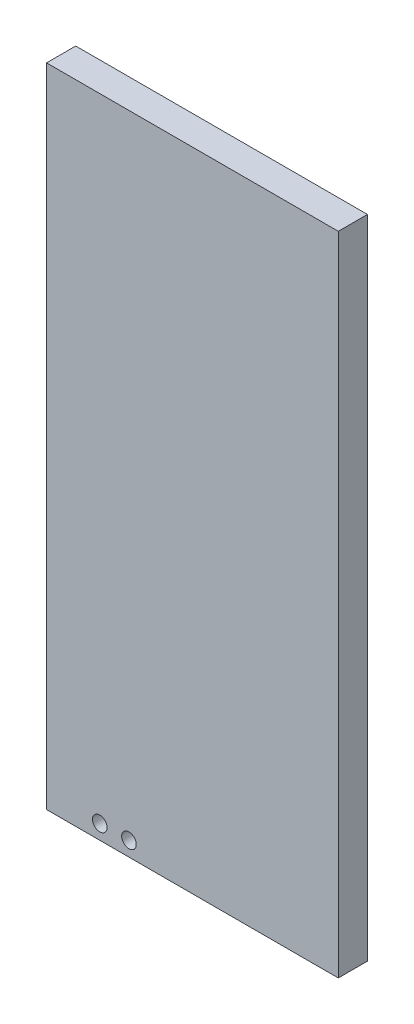
ISO-10303-21;
HEADER;
FILE_DESCRIPTION(('STEP AP214'),'2;1');
FILE_NAME('part.step','',(''),(''),'','','');
FILE_SCHEMA(('AUTOMOTIVE_DESIGN { 1 0 10303 214 1 1 1 1 }'));
ENDSEC;
DATA;
#1=APPLICATION_CONTEXT('core data for automotive mechanical design processes');
#2=APPLICATION_PROTOCOL_DEFINITION('international standard','automotive_design',2000,#1);
#3=PRODUCT_CONTEXT('',#1,'mechanical');
#4=PRODUCT('Part','Part','',(#3));
#5=PRODUCT_RELATED_PRODUCT_CATEGORY('part','',(#4));
#6=PRODUCT_DEFINITION_FORMATION('','',#4);
#7=PRODUCT_DEFINITION_CONTEXT('part definition',#1,'design');
#8=PRODUCT_DEFINITION('design','',#6,#7);
#9=PRODUCT_DEFINITION_SHAPE('','',#8);
#10=(LENGTH_UNIT() NAMED_UNIT(*) SI_UNIT(.MILLI.,.METRE.));
#11=(NAMED_UNIT(*) PLANE_ANGLE_UNIT() SI_UNIT($,.RADIAN.));
#12=(NAMED_UNIT(*) SI_UNIT($,.STERADIAN.) SOLID_ANGLE_UNIT());
#13=UNCERTAINTY_MEASURE_WITH_UNIT(LENGTH_MEASURE(1.E-05),#10,'distance_accuracy_value','');
#14=(GEOMETRIC_REPRESENTATION_CONTEXT(3) GLOBAL_UNCERTAINTY_ASSIGNED_CONTEXT((#13)) GLOBAL_UNIT_ASSIGNED_CONTEXT((#10,
#11,#12)) REPRESENTATION_CONTEXT('',''));
#15=CARTESIAN_POINT('',(0.,0.,0.));
#16=DIRECTION('',(0.,0.,1.));
#17=DIRECTION('',(1.,0.,0.));
#18=AXIS2_PLACEMENT_3D('',#15,#16,#17);
#19=CARTESIAN_POINT('',(-19.05,-63.5,6.));
#20=DIRECTION('',(0.,0.,-1.));
#21=DIRECTION('',(-1.,0.,0.));
#22=AXIS2_PLACEMENT_3D('',#19,#20,#21);
#23=CYLINDRICAL_SURFACE('',#22,1.5);
#24=CARTESIAN_POINT('',(-19.05,-63.5,6.));
#25=DIRECTION('',(0.,0.,-1.));
#26=DIRECTION('',(-1.,0.,0.));
#27=AXIS2_PLACEMENT_3D('',#24,#25,#26);
#28=CIRCLE('',#27,1.5);
#29=CARTESIAN_POINT('',(-20.55,-63.5,6.));
#30=VERTEX_POINT('',#29);
#31=EDGE_CURVE('E110',#30,#30,#28,.T.);
#32=ORIENTED_EDGE('',*,*,#31,.F.);
#33=EDGE_LOOP('',(#32));
#34=FACE_BOUND('',#33,.T.);
#35=CARTESIAN_POINT('',(-19.05,-63.5,3.));
#36=DIRECTION('',(0.,0.,-1.));
#37=DIRECTION('',(-1.,0.,0.));
#38=AXIS2_PLACEMENT_3D('',#35,#36,#37);
#39=CIRCLE('',#38,1.5);
#40=CARTESIAN_POINT('',(-20.55,-63.5,3.));
#41=VERTEX_POINT('',#40);
#42=EDGE_CURVE('E37',#41,#41,#39,.F.);
#43=ORIENTED_EDGE('',*,*,#42,.F.);
#44=EDGE_LOOP('',(#43));
#45=FACE_BOUND('',#44,.T.);
#46=ADVANCED_FACE('F33',(#34,#45),#23,.F.);
#47=CARTESIAN_POINT('',(-13.05,-63.5,6.));
#48=DIRECTION('',(0.,0.,-1.));
#49=DIRECTION('',(-1.,0.,0.));
#50=AXIS2_PLACEMENT_3D('',#47,#48,#49);
#51=CYLINDRICAL_SURFACE('',#50,1.5);
#52=CARTESIAN_POINT('',(-13.05,-63.5,6.));
#53=DIRECTION('',(0.,0.,-1.));
#54=DIRECTION('',(-1.,0.,0.));
#55=AXIS2_PLACEMENT_3D('',#52,#53,#54);
#56=CIRCLE('',#55,1.5);
#57=CARTESIAN_POINT('',(-14.55,-63.5,6.));
#58=VERTEX_POINT('',#57);
#59=EDGE_CURVE('E103',#58,#58,#56,.T.);
#60=ORIENTED_EDGE('',*,*,#59,.F.);
#61=EDGE_LOOP('',(#60));
#62=FACE_BOUND('',#61,.T.);
#63=CARTESIAN_POINT('',(-13.05,-63.5,3.));
#64=DIRECTION('',(0.,0.,-1.));
#65=DIRECTION('',(-1.,0.,0.));
#66=AXIS2_PLACEMENT_3D('',#63,#64,#65);
#67=CIRCLE('',#66,1.5);
#68=CARTESIAN_POINT('',(-14.55,-63.5,3.));
#69=VERTEX_POINT('',#68);
#70=EDGE_CURVE('E108',#69,#69,#67,.F.);
#71=ORIENTED_EDGE('',*,*,#70,.F.);
#72=EDGE_LOOP('',(#71));
#73=FACE_BOUND('',#72,.T.);
#74=ADVANCED_FACE('F131',(#62,#73),#51,.F.);
#75=CARTESIAN_POINT('',(-30.,66.5,6.));
#76=DIRECTION('',(1.,0.,0.));
#77=DIRECTION('',(0.,1.,0.));
#78=AXIS2_PLACEMENT_3D('',#75,#76,#77);
#79=PLANE('',#78);
#80=DIRECTION('',(0.,-1.,0.));
#81=VECTOR('',#80,1.);
#82=CARTESIAN_POINT('',(-30.,66.5,0.));
#83=LINE('',#82,#81);
#84=CARTESIAN_POINT('',(-30.,66.5,0.));
#85=VERTEX_POINT('',#84);
#86=CARTESIAN_POINT('',(-30.,-66.5,0.));
#87=VERTEX_POINT('',#86);
#88=EDGE_CURVE('E100',#85,#87,#83,.T.);
#89=ORIENTED_EDGE('',*,*,#88,.T.);
#90=DIRECTION('',(0.,0.,-1.));
#91=VECTOR('',#90,1.);
#92=CARTESIAN_POINT('',(-30.,-66.5,6.));
#93=LINE('',#92,#91);
#94=CARTESIAN_POINT('',(-30.,-66.5,6.));
#95=VERTEX_POINT('',#94);
#96=EDGE_CURVE('E11',#95,#87,#93,.T.);
#97=ORIENTED_EDGE('',*,*,#96,.F.);
#98=DIRECTION('',(0.,-1.,0.));
#99=VECTOR('',#98,1.);
#100=CARTESIAN_POINT('',(-30.,66.5,6.));
#101=LINE('',#100,#99);
#102=CARTESIAN_POINT('',(-30.,66.5,6.));
#103=VERTEX_POINT('',#102);
#104=EDGE_CURVE('E87',#103,#95,#101,.T.);
#105=ORIENTED_EDGE('',*,*,#104,.F.);
#106=DIRECTION('',(0.,0.,-1.));
#107=VECTOR('',#106,1.);
#108=CARTESIAN_POINT('',(-30.,66.5,6.));
#109=LINE('',#108,#107);
#110=EDGE_CURVE('E96',#103,#85,#109,.T.);
#111=ORIENTED_EDGE('',*,*,#110,.T.);
#112=EDGE_LOOP('',(#89,#97,#105,#111));
#113=FACE_BOUND('',#112,.T.);
#114=ADVANCED_FACE('F35',(#113),#79,.F.);
#115=CARTESIAN_POINT('',(-30.,-66.5,6.));
#116=DIRECTION('',(0.,1.,0.));
#117=DIRECTION('',(0.,0.,1.));
#118=AXIS2_PLACEMENT_3D('',#115,#116,#117);
#119=PLANE('',#118);
#120=DIRECTION('',(1.,0.,0.));
#121=VECTOR('',#120,1.);
#122=CARTESIAN_POINT('',(-30.,-66.5,0.));
#123=LINE('',#122,#121);
#124=CARTESIAN_POINT('',(30.,-66.5,0.));
#125=VERTEX_POINT('',#124);
#126=EDGE_CURVE('E91',#87,#125,#123,.T.);
#127=ORIENTED_EDGE('',*,*,#126,.T.);
#128=DIRECTION('',(0.,0.,-1.));
#129=VECTOR('',#128,1.);
#130=CARTESIAN_POINT('',(30.,-66.5,6.));
#131=LINE('',#130,#129);
#132=CARTESIAN_POINT('',(30.,-66.5,6.));
#133=VERTEX_POINT('',#132);
#134=EDGE_CURVE('E43',#133,#125,#131,.T.);
#135=ORIENTED_EDGE('',*,*,#134,.F.);
#136=DIRECTION('',(1.,0.,0.));
#137=VECTOR('',#136,1.);
#138=CARTESIAN_POINT('',(-30.,-66.5,6.));
#139=LINE('',#138,#137);
#140=EDGE_CURVE('E82',#95,#133,#139,.T.);
#141=ORIENTED_EDGE('',*,*,#140,.F.);
#142=ORIENTED_EDGE('',*,*,#96,.T.);
#143=EDGE_LOOP('',(#127,#135,#141,#142));
#144=FACE_BOUND('',#143,.T.);
#145=ADVANCED_FACE('F90',(#144),#119,.F.);
#146=CARTESIAN_POINT('',(30.,66.5,6.));
#147=DIRECTION('',(-1.,0.,0.));
#148=DIRECTION('',(0.,-1.,0.));
#149=AXIS2_PLACEMENT_3D('',#146,#147,#148);
#150=PLANE('',#149);
#151=DIRECTION('',(0.,1.,0.));
#152=VECTOR('',#151,1.);
#153=CARTESIAN_POINT('',(30.,66.5,0.));
#154=LINE('',#153,#152);
#155=CARTESIAN_POINT('',(30.,66.5,0.));
#156=VERTEX_POINT('',#155);
#157=EDGE_CURVE('E69',#125,#156,#154,.T.);
#158=ORIENTED_EDGE('',*,*,#157,.T.);
#159=DIRECTION('',(0.,0.,-1.));
#160=VECTOR('',#159,1.);
#161=CARTESIAN_POINT('',(30.,66.5,6.));
#162=LINE('',#161,#160);
#163=CARTESIAN_POINT('',(30.,66.5,6.));
#164=VERTEX_POINT('',#163);
#165=EDGE_CURVE('E92',#164,#156,#162,.T.);
#166=ORIENTED_EDGE('',*,*,#165,.F.);
#167=DIRECTION('',(0.,1.,0.));
#168=VECTOR('',#167,1.);
#169=CARTESIAN_POINT('',(30.,66.5,6.));
#170=LINE('',#169,#168);
#171=EDGE_CURVE('E85',#133,#164,#170,.T.);
#172=ORIENTED_EDGE('',*,*,#171,.F.);
#173=ORIENTED_EDGE('',*,*,#134,.T.);
#174=EDGE_LOOP('',(#158,#166,#172,#173));
#175=FACE_BOUND('',#174,.T.);
#176=ADVANCED_FACE('F94',(#175),#150,.F.);
#177=CARTESIAN_POINT('',(-30.,66.5,6.));
#178=DIRECTION('',(0.,-1.,0.));
#179=DIRECTION('',(0.,0.,-1.));
#180=AXIS2_PLACEMENT_3D('',#177,#178,#179);
#181=PLANE('',#180);
#182=DIRECTION('',(-1.,0.,0.));
#183=VECTOR('',#182,1.);
#184=CARTESIAN_POINT('',(-30.,66.5,0.));
#185=LINE('',#184,#183);
#186=EDGE_CURVE('E75',#156,#85,#185,.T.);
#187=ORIENTED_EDGE('',*,*,#186,.T.);
#188=ORIENTED_EDGE('',*,*,#110,.F.);
#189=DIRECTION('',(-1.,0.,0.));
#190=VECTOR('',#189,1.);
#191=CARTESIAN_POINT('',(-30.,66.5,6.));
#192=LINE('',#191,#190);
#193=EDGE_CURVE('E52',#164,#103,#192,.T.);
#194=ORIENTED_EDGE('',*,*,#193,.F.);
#195=ORIENTED_EDGE('',*,*,#165,.T.);
#196=EDGE_LOOP('',(#187,#188,#194,#195));
#197=FACE_BOUND('',#196,.T.);
#198=ADVANCED_FACE('F147',(#197),#181,.F.);
#199=CARTESIAN_POINT('',(0.,0.,6.));
#200=DIRECTION('',(0.,0.,1.));
#201=DIRECTION('',(1.,0.,0.));
#202=AXIS2_PLACEMENT_3D('',#199,#200,#201);
#203=PLANE('',#202);
#204=ORIENTED_EDGE('',*,*,#31,.T.);
#205=EDGE_LOOP('',(#204));
#206=FACE_BOUND('',#205,.T.);
#207=ORIENTED_EDGE('',*,*,#59,.T.);
#208=EDGE_LOOP('',(#207));
#209=FACE_BOUND('',#208,.T.);
#210=ORIENTED_EDGE('',*,*,#104,.T.);
#211=ORIENTED_EDGE('',*,*,#140,.T.);
#212=ORIENTED_EDGE('',*,*,#171,.T.);
#213=ORIENTED_EDGE('',*,*,#193,.T.);
#214=EDGE_LOOP('',(#210,#211,#212,#213));
#215=FACE_BOUND('',#214,.T.);
#216=ADVANCED_FACE('F83',(#206,#209,#215),#203,.T.);
#217=CARTESIAN_POINT('',(0.,0.,0.));
#218=DIRECTION('',(0.,0.,1.));
#219=DIRECTION('',(1.,0.,0.));
#220=AXIS2_PLACEMENT_3D('',#217,#218,#219);
#221=PLANE('',#220);
#222=CARTESIAN_POINT('',(-19.05,-63.5,0.));
#223=DIRECTION('',(0.,0.,-1.));
#224=DIRECTION('',(-1.,0.,0.));
#225=AXIS2_PLACEMENT_3D('',#222,#223,#224);
#226=CIRCLE('',#225,2.99499999999999);
#227=CARTESIAN_POINT('',(-22.045,-63.5,0.));
#228=VERTEX_POINT('',#227);
#229=EDGE_CURVE('E124',#228,#228,#226,.T.);
#230=ORIENTED_EDGE('',*,*,#229,.F.);
#231=EDGE_LOOP('',(#230));
#232=FACE_BOUND('',#231,.T.);
#233=CARTESIAN_POINT('',(-13.05,-63.5,0.));
#234=DIRECTION('',(0.,0.,-1.));
#235=DIRECTION('',(-1.,0.,0.));
#236=AXIS2_PLACEMENT_3D('',#233,#234,#235);
#237=CIRCLE('',#236,2.995);
#238=CARTESIAN_POINT('',(-16.045,-63.5,0.));
#239=VERTEX_POINT('',#238);
#240=EDGE_CURVE('E117',#239,#239,#237,.T.);
#241=ORIENTED_EDGE('',*,*,#240,.F.);
#242=EDGE_LOOP('',(#241));
#243=FACE_BOUND('',#242,.T.);
#244=ORIENTED_EDGE('',*,*,#88,.F.);
#245=ORIENTED_EDGE('',*,*,#186,.F.);
#246=ORIENTED_EDGE('',*,*,#157,.F.);
#247=ORIENTED_EDGE('',*,*,#126,.F.);
#248=EDGE_LOOP('',(#244,#245,#246,#247));
#249=FACE_BOUND('',#248,.T.);
#250=ADVANCED_FACE('F146',(#232,#243,#249),#221,.F.);
#251=CARTESIAN_POINT('',(-13.05,-63.5,3.));
#252=DIRECTION('',(0.,0.,-1.));
#253=DIRECTION('',(-1.,0.,0.));
#254=AXIS2_PLACEMENT_3D('',#251,#252,#253);
#255=PLANE('',#254);
#256=CARTESIAN_POINT('',(-13.05,-63.5,3.));
#257=DIRECTION('',(0.,0.,-1.));
#258=DIRECTION('',(-1.,0.,0.));
#259=AXIS2_PLACEMENT_3D('',#256,#257,#258);
#260=CIRCLE('',#259,2.995);
#261=CARTESIAN_POINT('',(-16.045,-63.5,3.));
#262=VERTEX_POINT('',#261);
#263=EDGE_CURVE('E111',#262,#262,#260,.T.);
#264=ORIENTED_EDGE('',*,*,#263,.T.);
#265=EDGE_LOOP('',(#264));
#266=FACE_BOUND('',#265,.T.);
#267=ORIENTED_EDGE('',*,*,#70,.T.);
#268=EDGE_LOOP('',(#267));
#269=FACE_BOUND('',#268,.T.);
#270=ADVANCED_FACE('F151',(#266,#269),#255,.T.);
#271=CARTESIAN_POINT('',(-13.05,-63.5,3.));
#272=DIRECTION('',(0.,0.,-1.));
#273=DIRECTION('',(-1.,0.,0.));
#274=AXIS2_PLACEMENT_3D('',#271,#272,#273);
#275=CYLINDRICAL_SURFACE('',#274,2.995);
#276=ORIENTED_EDGE('',*,*,#263,.F.);
#277=EDGE_LOOP('',(#276));
#278=FACE_BOUND('',#277,.T.);
#279=ORIENTED_EDGE('',*,*,#240,.T.);
#280=EDGE_LOOP('',(#279));
#281=FACE_BOUND('',#280,.T.);
#282=ADVANCED_FACE('F184',(#278,#281),#275,.F.);
#283=CARTESIAN_POINT('',(-19.05,-63.5,3.));
#284=DIRECTION('',(0.,0.,-1.));
#285=DIRECTION('',(-1.,0.,0.));
#286=AXIS2_PLACEMENT_3D('',#283,#284,#285);
#287=PLANE('',#286);
#288=CARTESIAN_POINT('',(-19.05,-63.5,3.));
#289=DIRECTION('',(0.,0.,-1.));
#290=DIRECTION('',(-1.,0.,0.));
#291=AXIS2_PLACEMENT_3D('',#288,#289,#290);
#292=CIRCLE('',#291,2.99499999999999);
#293=CARTESIAN_POINT('',(-22.045,-63.5,3.));
#294=VERTEX_POINT('',#293);
#295=EDGE_CURVE('E243',#294,#294,#292,.T.);
#296=ORIENTED_EDGE('',*,*,#295,.T.);
#297=EDGE_LOOP('',(#296));
#298=FACE_BOUND('',#297,.T.);
#299=ORIENTED_EDGE('',*,*,#42,.T.);
#300=EDGE_LOOP('',(#299));
#301=FACE_BOUND('',#300,.T.);
#302=ADVANCED_FACE('F191',(#298,#301),#287,.T.);
#303=CARTESIAN_POINT('',(-19.05,-63.5,3.));
#304=DIRECTION('',(0.,0.,-1.));
#305=DIRECTION('',(-1.,0.,0.));
#306=AXIS2_PLACEMENT_3D('',#303,#304,#305);
#307=CYLINDRICAL_SURFACE('',#306,2.99499999999999);
#308=ORIENTED_EDGE('',*,*,#295,.F.);
#309=EDGE_LOOP('',(#308));
#310=FACE_BOUND('',#309,.T.);
#311=ORIENTED_EDGE('',*,*,#229,.T.);
#312=EDGE_LOOP('',(#311));
#313=FACE_BOUND('',#312,.T.);
#314=ADVANCED_FACE('F198',(#310,#313),#307,.F.);
#315=CLOSED_SHELL('',(#46,#74,#114,#145,#176,#198,#216,#250,#270,#282,#302,#314));
#316=MANIFOLD_SOLID_BREP('B2',#315);
#317=ADVANCED_BREP_SHAPE_REPRESENTATION('',(#18,#316),#14);
#318=SHAPE_DEFINITION_REPRESENTATION(#9,#317);
ENDSEC;
END-ISO-10303-21;
